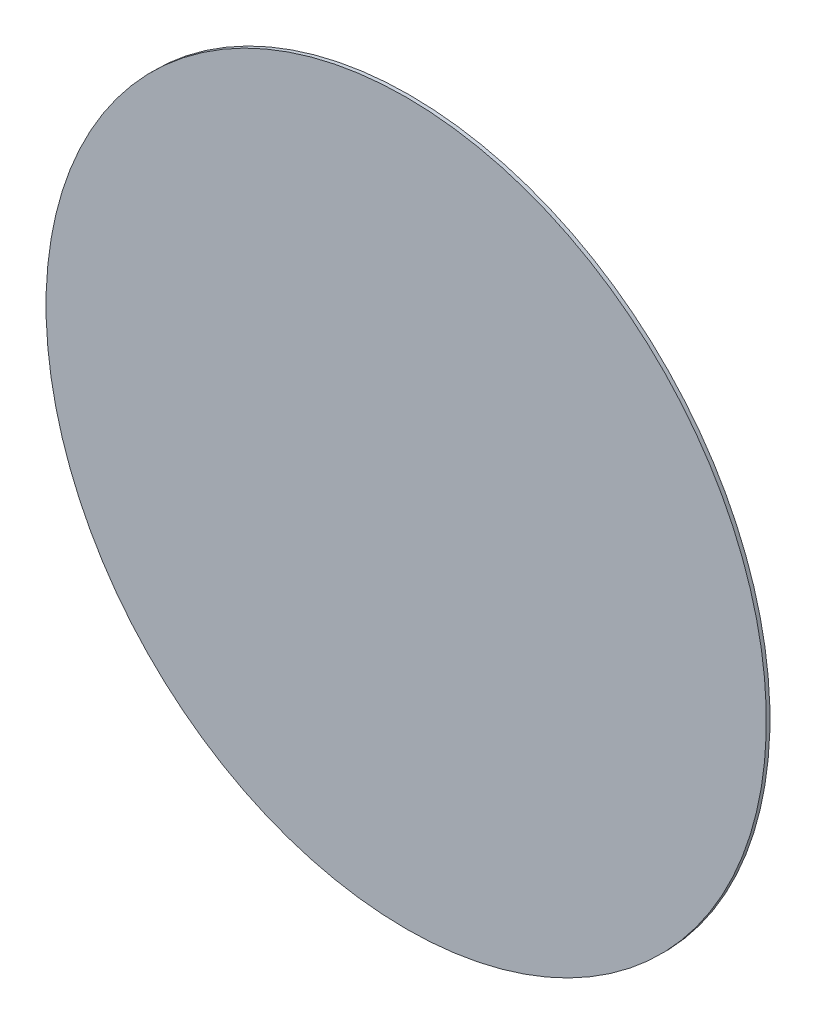
ISO-10303-21;
HEADER;
FILE_DESCRIPTION(('STEP AP214'),'2;1');
FILE_NAME('part.step','',(''),(''),'','','');
FILE_SCHEMA(('AUTOMOTIVE_DESIGN { 1 0 10303 214 1 1 1 1 }'));
ENDSEC;
DATA;
#1=APPLICATION_CONTEXT('core data for automotive mechanical design processes');
#2=APPLICATION_PROTOCOL_DEFINITION('international standard','automotive_design',2000,#1);
#3=PRODUCT_CONTEXT('',#1,'mechanical');
#4=PRODUCT('Part','Part','',(#3));
#5=PRODUCT_RELATED_PRODUCT_CATEGORY('part','',(#4));
#6=PRODUCT_DEFINITION_FORMATION('','',#4);
#7=PRODUCT_DEFINITION_CONTEXT('part definition',#1,'design');
#8=PRODUCT_DEFINITION('design','',#6,#7);
#9=PRODUCT_DEFINITION_SHAPE('','',#8);
#10=(LENGTH_UNIT() NAMED_UNIT(*) SI_UNIT(.MILLI.,.METRE.));
#11=(NAMED_UNIT(*) PLANE_ANGLE_UNIT() SI_UNIT($,.RADIAN.));
#12=(NAMED_UNIT(*) SI_UNIT($,.STERADIAN.) SOLID_ANGLE_UNIT());
#13=UNCERTAINTY_MEASURE_WITH_UNIT(LENGTH_MEASURE(1.E-05),#10,'distance_accuracy_value','');
#14=(GEOMETRIC_REPRESENTATION_CONTEXT(3) GLOBAL_UNCERTAINTY_ASSIGNED_CONTEXT((#13)) GLOBAL_UNIT_ASSIGNED_CONTEXT((#10,
#11,#12)) REPRESENTATION_CONTEXT('',''));
#15=CARTESIAN_POINT('',(0.,0.,0.));
#16=DIRECTION('',(0.,0.,1.));
#17=DIRECTION('',(1.,0.,0.));
#18=AXIS2_PLACEMENT_3D('',#15,#16,#17);
#19=CARTESIAN_POINT('',(108.400273577785,40.7008697660205,11.7992775900885));
#20=DIRECTION('',(0.,0.,1.));
#21=DIRECTION('',(1.,0.,0.));
#22=AXIS2_PLACEMENT_3D('',#19,#20,#21);
#23=PLANE('',#22);
#24=CARTESIAN_POINT('',(108.400273577785,40.7008697660205,11.7992775900885));
#25=DIRECTION('',(0.,0.,-1.));
#26=DIRECTION('',(0.,-1.,0.));
#27=AXIS2_PLACEMENT_3D('',#24,#25,#26);
#28=CIRCLE('',#27,0.200024999999995);
#29=CARTESIAN_POINT('',(108.400273577785,40.5008447660205,11.7992775900885));
#30=VERTEX_POINT('',#29);
#31=EDGE_CURVE('E11',#30,#30,#28,.T.);
#32=ORIENTED_EDGE('',*,*,#31,.F.);
#33=EDGE_LOOP('',(#32));
#34=FACE_BOUND('',#33,.T.);
#35=ADVANCED_FACE('F40',(#34),#23,.T.);
#36=CARTESIAN_POINT('',(108.400273577785,40.7008697660205,11.7972775900885));
#37=DIRECTION('',(0.,0.,-1.));
#38=DIRECTION('',(-1.,0.,0.));
#39=AXIS2_PLACEMENT_3D('',#36,#37,#38);
#40=PLANE('',#39);
#41=CARTESIAN_POINT('',(108.400273577785,40.7008697660205,11.7972775900885));
#42=DIRECTION('',(0.,0.,1.));
#43=DIRECTION('',(2.66420223382122E-13,1.,0.));
#44=AXIS2_PLACEMENT_3D('',#41,#42,#43);
#45=CIRCLE('',#44,0.200024999999995);
#46=CARTESIAN_POINT('',(108.400273577785,40.5008447660205,11.7972775900885));
#47=VERTEX_POINT('',#46);
#48=EDGE_CURVE('E57',#47,#47,#45,.T.);
#49=ORIENTED_EDGE('',*,*,#48,.F.);
#50=EDGE_LOOP('',(#49));
#51=FACE_BOUND('',#50,.T.);
#52=ADVANCED_FACE('F42',(#51),#40,.T.);
#53=CARTESIAN_POINT('',(108.400273577785,40.7008697660205,11.7972775900885));
#54=DIRECTION('',(0.,0.,-1.));
#55=DIRECTION('',(3.55226964509433E-13,1.,0.));
#56=AXIS2_PLACEMENT_3D('',#53,#54,#55);
#57=CYLINDRICAL_SURFACE('',#56,0.20002500000003);
#58=ORIENTED_EDGE('',*,*,#48,.T.);
#59=DIRECTION('',(0.,0.,1.));
#60=VECTOR('',#59,1.);
#61=CARTESIAN_POINT('',(108.400273577785,40.5008447660205,11.7972775900885));
#62=LINE('',#61,#60);
#63=EDGE_CURVE('E49',#47,#30,#62,.T.);
#64=ORIENTED_EDGE('',*,*,#63,.T.);
#65=ORIENTED_EDGE('',*,*,#31,.T.);
#66=ORIENTED_EDGE('',*,*,#63,.F.);
#67=EDGE_LOOP('',(#58,#64,#65,#66));
#68=FACE_BOUND('',#67,.T.);
#69=ADVANCED_FACE('F55',(#68),#57,.T.);
#70=CLOSED_SHELL('',(#35,#52,#69));
#71=MANIFOLD_SOLID_BREP('B2',#70);
#72=ADVANCED_BREP_SHAPE_REPRESENTATION('',(#18,#71),#14);
#73=SHAPE_DEFINITION_REPRESENTATION(#9,#72);
ENDSEC;
END-ISO-10303-21;
